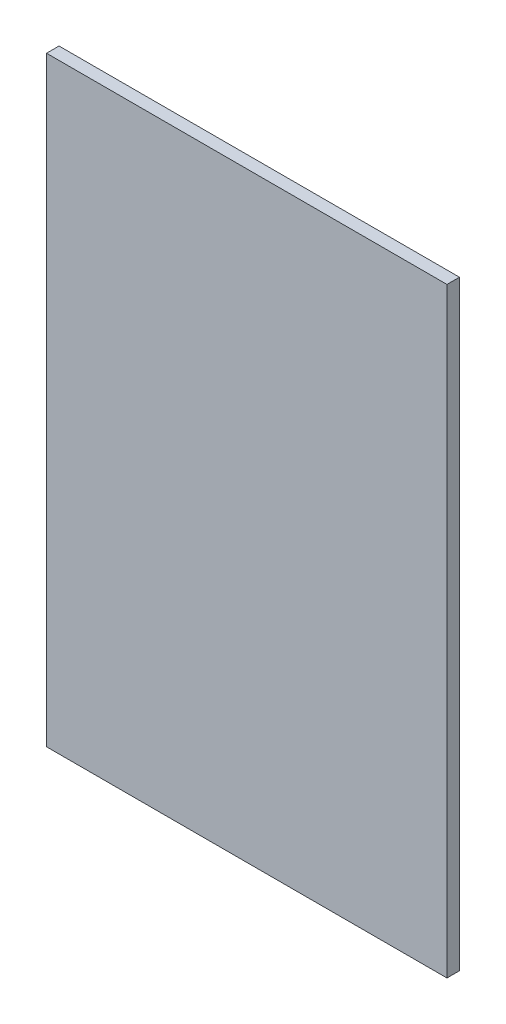
ISO-10303-21;
HEADER;
FILE_DESCRIPTION(('STEP AP214'),'2;1');
FILE_NAME('part.step','',(''),(''),'','','');
FILE_SCHEMA(('AUTOMOTIVE_DESIGN { 1 0 10303 214 1 1 1 1 }'));
ENDSEC;
DATA;
#1=APPLICATION_CONTEXT('core data for automotive mechanical design processes');
#2=APPLICATION_PROTOCOL_DEFINITION('international standard','automotive_design',2000,#1);
#3=PRODUCT_CONTEXT('',#1,'mechanical');
#4=PRODUCT('Part','Part','',(#3));
#5=PRODUCT_RELATED_PRODUCT_CATEGORY('part','',(#4));
#6=PRODUCT_DEFINITION_FORMATION('','',#4);
#7=PRODUCT_DEFINITION_CONTEXT('part definition',#1,'design');
#8=PRODUCT_DEFINITION('design','',#6,#7);
#9=PRODUCT_DEFINITION_SHAPE('','',#8);
#10=(LENGTH_UNIT() NAMED_UNIT(*) SI_UNIT(.MILLI.,.METRE.));
#11=(NAMED_UNIT(*) PLANE_ANGLE_UNIT() SI_UNIT($,.RADIAN.));
#12=(NAMED_UNIT(*) SI_UNIT($,.STERADIAN.) SOLID_ANGLE_UNIT());
#13=UNCERTAINTY_MEASURE_WITH_UNIT(LENGTH_MEASURE(1.E-05),#10,'distance_accuracy_value','');
#14=(GEOMETRIC_REPRESENTATION_CONTEXT(3) GLOBAL_UNCERTAINTY_ASSIGNED_CONTEXT((#13)) GLOBAL_UNIT_ASSIGNED_CONTEXT((#10,
#11,#12)) REPRESENTATION_CONTEXT('',''));
#15=CARTESIAN_POINT('',(0.,0.,0.));
#16=DIRECTION('',(0.,0.,1.));
#17=DIRECTION('',(1.,0.,0.));
#18=AXIS2_PLACEMENT_3D('',#15,#16,#17);
#19=CARTESIAN_POINT('',(0.,0.,1.5875));
#20=DIRECTION('',(1.,0.,0.));
#21=DIRECTION('',(0.,0.,-1.));
#22=AXIS2_PLACEMENT_3D('',#19,#20,#21);
#23=PLANE('',#22);
#24=DIRECTION('',(0.,-1.,0.));
#25=VECTOR('',#24,1.);
#26=CARTESIAN_POINT('',(0.,0.,0.));
#27=LINE('',#26,#25);
#28=CARTESIAN_POINT('',(0.,76.2,0.));
#29=VERTEX_POINT('',#28);
#30=CARTESIAN_POINT('',(0.,0.,0.));
#31=VERTEX_POINT('',#30);
#32=EDGE_CURVE('E107',#29,#31,#27,.T.);
#33=ORIENTED_EDGE('',*,*,#32,.T.);
#34=DIRECTION('',(0.,0.,-1.));
#35=VECTOR('',#34,1.);
#36=CARTESIAN_POINT('',(0.,0.,1.5875));
#37=LINE('',#36,#35);
#38=CARTESIAN_POINT('',(0.,0.,1.5875));
#39=VERTEX_POINT('',#38);
#40=EDGE_CURVE('E11',#39,#31,#37,.T.);
#41=ORIENTED_EDGE('',*,*,#40,.F.);
#42=DIRECTION('',(0.,-1.,0.));
#43=VECTOR('',#42,1.);
#44=CARTESIAN_POINT('',(0.,0.,1.5875));
#45=LINE('',#44,#43);
#46=CARTESIAN_POINT('',(0.,76.2,1.5875));
#47=VERTEX_POINT('',#46);
#48=EDGE_CURVE('E91',#47,#39,#45,.T.);
#49=ORIENTED_EDGE('',*,*,#48,.F.);
#50=DIRECTION('',(0.,0.,-1.));
#51=VECTOR('',#50,1.);
#52=CARTESIAN_POINT('',(0.,76.2,1.5875));
#53=LINE('',#52,#51);
#54=EDGE_CURVE('E103',#47,#29,#53,.T.);
#55=ORIENTED_EDGE('',*,*,#54,.T.);
#56=EDGE_LOOP('',(#33,#41,#49,#55));
#57=FACE_BOUND('',#56,.T.);
#58=ADVANCED_FACE('F39',(#57),#23,.F.);
#59=CARTESIAN_POINT('',(0.,0.,1.5875));
#60=DIRECTION('',(0.,1.,0.));
#61=DIRECTION('',(0.,0.,1.));
#62=AXIS2_PLACEMENT_3D('',#59,#60,#61);
#63=PLANE('',#62);
#64=DIRECTION('',(1.,0.,0.));
#65=VECTOR('',#64,1.);
#66=CARTESIAN_POINT('',(0.,0.,0.));
#67=LINE('',#66,#65);
#68=CARTESIAN_POINT('',(50.8,0.,0.));
#69=VERTEX_POINT('',#68);
#70=EDGE_CURVE('E96',#31,#69,#67,.T.);
#71=ORIENTED_EDGE('',*,*,#70,.T.);
#72=DIRECTION('',(0.,0.,-1.));
#73=VECTOR('',#72,1.);
#74=CARTESIAN_POINT('',(50.8,0.,1.5875));
#75=LINE('',#74,#73);
#76=CARTESIAN_POINT('',(50.8,0.,1.5875));
#77=VERTEX_POINT('',#76);
#78=EDGE_CURVE('E48',#77,#69,#75,.T.);
#79=ORIENTED_EDGE('',*,*,#78,.F.);
#80=DIRECTION('',(1.,0.,0.));
#81=VECTOR('',#80,1.);
#82=CARTESIAN_POINT('',(0.,0.,1.5875));
#83=LINE('',#82,#81);
#84=EDGE_CURVE('E86',#39,#77,#83,.T.);
#85=ORIENTED_EDGE('',*,*,#84,.F.);
#86=ORIENTED_EDGE('',*,*,#40,.T.);
#87=EDGE_LOOP('',(#71,#79,#85,#86));
#88=FACE_BOUND('',#87,.T.);
#89=ADVANCED_FACE('F95',(#88),#63,.F.);
#90=CARTESIAN_POINT('',(50.8,0.,1.5875));
#91=DIRECTION('',(-1.,0.,0.));
#92=DIRECTION('',(0.,0.,1.));
#93=AXIS2_PLACEMENT_3D('',#90,#91,#92);
#94=PLANE('',#93);
#95=DIRECTION('',(0.,1.,0.));
#96=VECTOR('',#95,1.);
#97=CARTESIAN_POINT('',(50.8,0.,0.));
#98=LINE('',#97,#96);
#99=CARTESIAN_POINT('',(50.8,76.2,0.));
#100=VERTEX_POINT('',#99);
#101=EDGE_CURVE('E73',#69,#100,#98,.T.);
#102=ORIENTED_EDGE('',*,*,#101,.T.);
#103=DIRECTION('',(0.,0.,-1.));
#104=VECTOR('',#103,1.);
#105=CARTESIAN_POINT('',(50.8,76.2,1.5875));
#106=LINE('',#105,#104);
#107=CARTESIAN_POINT('',(50.8,76.2,1.5875));
#108=VERTEX_POINT('',#107);
#109=EDGE_CURVE('E98',#108,#100,#106,.T.);
#110=ORIENTED_EDGE('',*,*,#109,.F.);
#111=DIRECTION('',(0.,1.,0.));
#112=VECTOR('',#111,1.);
#113=CARTESIAN_POINT('',(50.8,0.,1.5875));
#114=LINE('',#113,#112);
#115=EDGE_CURVE('E89',#77,#108,#114,.T.);
#116=ORIENTED_EDGE('',*,*,#115,.F.);
#117=ORIENTED_EDGE('',*,*,#78,.T.);
#118=EDGE_LOOP('',(#102,#110,#116,#117));
#119=FACE_BOUND('',#118,.T.);
#120=ADVANCED_FACE('F99',(#119),#94,.F.);
#121=CARTESIAN_POINT('',(0.,76.2,1.5875));
#122=DIRECTION('',(0.,-1.,0.));
#123=DIRECTION('',(0.,0.,-1.));
#124=AXIS2_PLACEMENT_3D('',#121,#122,#123);
#125=PLANE('',#124);
#126=DIRECTION('',(-1.,0.,0.));
#127=VECTOR('',#126,1.);
#128=CARTESIAN_POINT('',(0.,76.2,0.));
#129=LINE('',#128,#127);
#130=EDGE_CURVE('E79',#100,#29,#129,.T.);
#131=ORIENTED_EDGE('',*,*,#130,.T.);
#132=ORIENTED_EDGE('',*,*,#54,.F.);
#133=DIRECTION('',(-1.,0.,0.));
#134=VECTOR('',#133,1.);
#135=CARTESIAN_POINT('',(0.,76.2,1.5875));
#136=LINE('',#135,#134);
#137=EDGE_CURVE('E56',#108,#47,#136,.T.);
#138=ORIENTED_EDGE('',*,*,#137,.F.);
#139=ORIENTED_EDGE('',*,*,#109,.T.);
#140=EDGE_LOOP('',(#131,#132,#138,#139));
#141=FACE_BOUND('',#140,.T.);
#142=ADVANCED_FACE('F120',(#141),#125,.F.);
#143=CARTESIAN_POINT('',(0.,0.,1.5875));
#144=DIRECTION('',(0.,0.,-1.));
#145=DIRECTION('',(-1.,0.,0.));
#146=AXIS2_PLACEMENT_3D('',#143,#144,#145);
#147=PLANE('',#146);
#148=ORIENTED_EDGE('',*,*,#48,.T.);
#149=ORIENTED_EDGE('',*,*,#84,.T.);
#150=ORIENTED_EDGE('',*,*,#115,.T.);
#151=ORIENTED_EDGE('',*,*,#137,.T.);
#152=EDGE_LOOP('',(#148,#149,#150,#151));
#153=FACE_BOUND('',#152,.T.);
#154=ADVANCED_FACE('F87',(#153),#147,.F.);
#155=CARTESIAN_POINT('',(0.,0.,0.));
#156=DIRECTION('',(0.,0.,-1.));
#157=DIRECTION('',(-1.,0.,0.));
#158=AXIS2_PLACEMENT_3D('',#155,#156,#157);
#159=PLANE('',#158);
#160=ORIENTED_EDGE('',*,*,#32,.F.);
#161=ORIENTED_EDGE('',*,*,#130,.F.);
#162=ORIENTED_EDGE('',*,*,#101,.F.);
#163=ORIENTED_EDGE('',*,*,#70,.F.);
#164=EDGE_LOOP('',(#160,#161,#162,#163));
#165=FACE_BOUND('',#164,.T.);
#166=ADVANCED_FACE('F123',(#165),#159,.T.);
#167=CLOSED_SHELL('',(#58,#89,#120,#142,#154,#166));
#168=MANIFOLD_SOLID_BREP('B2',#167);
#169=ADVANCED_BREP_SHAPE_REPRESENTATION('',(#18,#168),#14);
#170=SHAPE_DEFINITION_REPRESENTATION(#9,#169);
ENDSEC;
END-ISO-10303-21;
